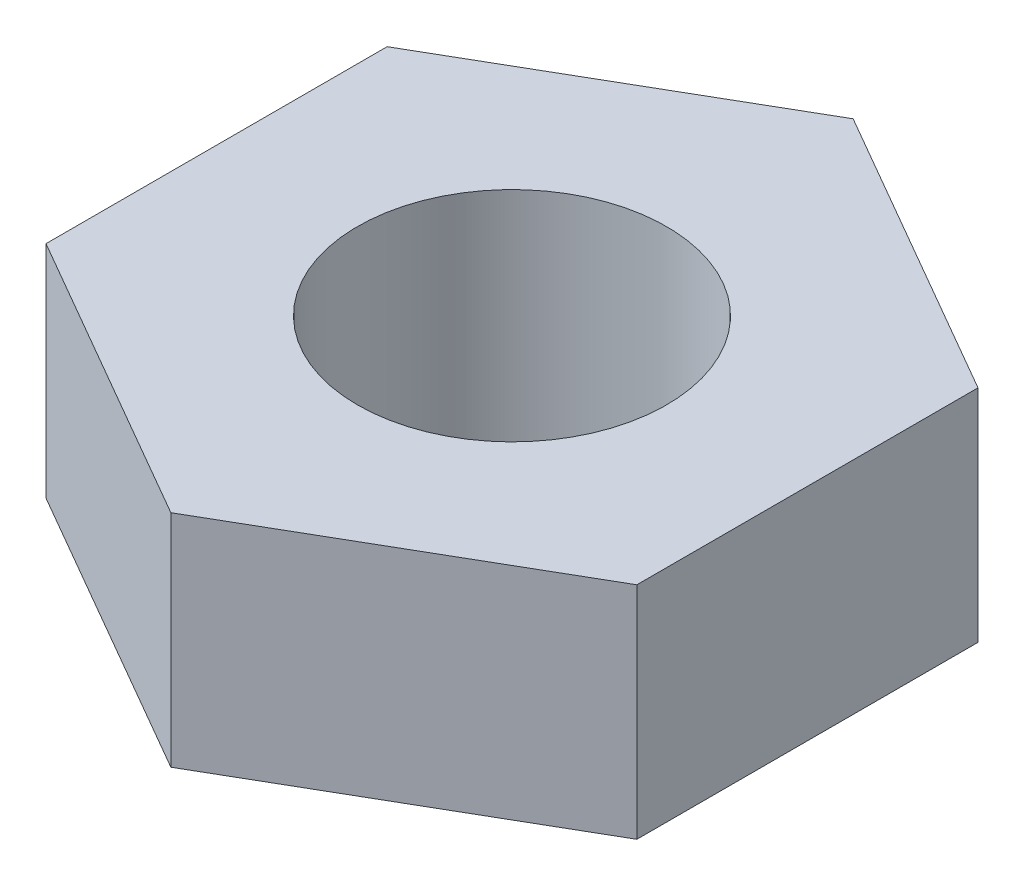
ISO-10303-21;
HEADER;
FILE_DESCRIPTION(('STEP AP214'),'2;1');
FILE_NAME('part.step','',(''),(''),'','','');
FILE_SCHEMA(('AUTOMOTIVE_DESIGN { 1 0 10303 214 1 1 1 1 }'));
ENDSEC;
DATA;
#1=APPLICATION_CONTEXT('core data for automotive mechanical design processes');
#2=APPLICATION_PROTOCOL_DEFINITION('international standard','automotive_design',2000,#1);
#3=PRODUCT_CONTEXT('',#1,'mechanical');
#4=PRODUCT('Part','Part','',(#3));
#5=PRODUCT_RELATED_PRODUCT_CATEGORY('part','',(#4));
#6=PRODUCT_DEFINITION_FORMATION('','',#4);
#7=PRODUCT_DEFINITION_CONTEXT('part definition',#1,'design');
#8=PRODUCT_DEFINITION('design','',#6,#7);
#9=PRODUCT_DEFINITION_SHAPE('','',#8);
#10=(LENGTH_UNIT() NAMED_UNIT(*) SI_UNIT(.MILLI.,.METRE.));
#11=(NAMED_UNIT(*) PLANE_ANGLE_UNIT() SI_UNIT($,.RADIAN.));
#12=(NAMED_UNIT(*) SI_UNIT($,.STERADIAN.) SOLID_ANGLE_UNIT());
#13=UNCERTAINTY_MEASURE_WITH_UNIT(LENGTH_MEASURE(1.E-05),#10,'distance_accuracy_value','');
#14=(GEOMETRIC_REPRESENTATION_CONTEXT(3) GLOBAL_UNCERTAINTY_ASSIGNED_CONTEXT((#13)) GLOBAL_UNIT_ASSIGNED_CONTEXT((#10,
#11,#12)) REPRESENTATION_CONTEXT('',''));
#15=CARTESIAN_POINT('',(0.,0.,0.));
#16=DIRECTION('',(0.,0.,1.));
#17=DIRECTION('',(1.,0.,0.));
#18=AXIS2_PLACEMENT_3D('',#15,#16,#17);
#19=CARTESIAN_POINT('',(0.,4.85,0.));
#20=DIRECTION('',(0.,1.,0.));
#21=DIRECTION('',(0.,0.,1.));
#22=AXIS2_PLACEMENT_3D('',#19,#20,#21);
#23=PLANE('',#22);
#24=DIRECTION('',(0.866025403784439,0.,0.5));
#25=VECTOR('',#24,1.);
#26=CARTESIAN_POINT('',(-6.50000000000001,4.85,3.75277674973259));
#27=LINE('',#26,#25);
#28=CARTESIAN_POINT('',(-6.50000000000001,4.85,3.75277674973259));
#29=VERTEX_POINT('',#28);
#30=CARTESIAN_POINT('',(0.,4.85,7.50555349946516));
#31=VERTEX_POINT('',#30);
#32=EDGE_CURVE('E132',#29,#31,#27,.T.);
#33=ORIENTED_EDGE('',*,*,#32,.T.);
#34=DIRECTION('',(0.866025403784439,0.,-0.5));
#35=VECTOR('',#34,1.);
#36=CARTESIAN_POINT('',(0.,4.85,7.50555349946516));
#37=LINE('',#36,#35);
#38=CARTESIAN_POINT('',(6.49999999999998,4.85,3.75277674973259));
#39=VERTEX_POINT('',#38);
#40=EDGE_CURVE('E90',#31,#39,#37,.T.);
#41=ORIENTED_EDGE('',*,*,#40,.T.);
#42=DIRECTION('',(0.,0.,-1.));
#43=VECTOR('',#42,1.);
#44=CARTESIAN_POINT('',(6.49999999999998,4.85,3.75277674973259));
#45=LINE('',#44,#43);
#46=CARTESIAN_POINT('',(6.49999999999998,4.85,-3.75277674973256));
#47=VERTEX_POINT('',#46);
#48=EDGE_CURVE('E103',#39,#47,#45,.T.);
#49=ORIENTED_EDGE('',*,*,#48,.T.);
#50=DIRECTION('',(-0.866025403784439,0.,-0.5));
#51=VECTOR('',#50,1.);
#52=CARTESIAN_POINT('',(6.49999999999998,4.85,-3.75277674973256));
#53=LINE('',#52,#51);
#54=CARTESIAN_POINT('',(0.,4.85,-7.50555349946512));
#55=VERTEX_POINT('',#54);
#56=EDGE_CURVE('E97',#47,#55,#53,.T.);
#57=ORIENTED_EDGE('',*,*,#56,.T.);
#58=DIRECTION('',(-0.866025403784438,0.,0.5));
#59=VECTOR('',#58,1.);
#60=CARTESIAN_POINT('',(0.,4.85,-7.50555349946512));
#61=LINE('',#60,#59);
#62=CARTESIAN_POINT('',(-6.50000000000001,4.85,-3.75277674973254));
#63=VERTEX_POINT('',#62);
#64=EDGE_CURVE('E101',#55,#63,#61,.T.);
#65=ORIENTED_EDGE('',*,*,#64,.T.);
#66=DIRECTION('',(0.,0.,1.));
#67=VECTOR('',#66,1.);
#68=CARTESIAN_POINT('',(-6.50000000000001,4.85,-3.75277674973254));
#69=LINE('',#68,#67);
#70=EDGE_CURVE('E53',#63,#29,#69,.T.);
#71=ORIENTED_EDGE('',*,*,#70,.T.);
#72=EDGE_LOOP('',(#33,#41,#49,#57,#65,#71));
#73=FACE_BOUND('',#72,.T.);
#74=CARTESIAN_POINT('',(0.,4.85,0.));
#75=DIRECTION('',(0.,1.,0.));
#76=DIRECTION('',(0.,0.,1.));
#77=AXIS2_PLACEMENT_3D('',#74,#75,#76);
#78=CIRCLE('',#77,3.4);
#79=CARTESIAN_POINT('',(0.,4.85,3.4));
#80=VERTEX_POINT('',#79);
#81=EDGE_CURVE('E125',#80,#80,#78,.T.);
#82=ORIENTED_EDGE('',*,*,#81,.F.);
#83=EDGE_LOOP('',(#82));
#84=FACE_BOUND('',#83,.T.);
#85=ADVANCED_FACE('F36',(#73,#84),#23,.T.);
#86=CARTESIAN_POINT('',(0.,0.,0.));
#87=DIRECTION('',(0.,1.,0.));
#88=DIRECTION('',(0.,0.,1.));
#89=AXIS2_PLACEMENT_3D('',#86,#87,#88);
#90=PLANE('',#89);
#91=DIRECTION('',(0.866025403784439,0.,0.5));
#92=VECTOR('',#91,1.);
#93=CARTESIAN_POINT('',(-6.50000000000001,0.,3.75277674973259));
#94=LINE('',#93,#92);
#95=CARTESIAN_POINT('',(-6.50000000000001,0.,3.75277674973259));
#96=VERTEX_POINT('',#95);
#97=CARTESIAN_POINT('',(0.,0.,7.50555349946516));
#98=VERTEX_POINT('',#97);
#99=EDGE_CURVE('E121',#96,#98,#94,.T.);
#100=ORIENTED_EDGE('',*,*,#99,.F.);
#101=DIRECTION('',(0.,0.,1.));
#102=VECTOR('',#101,1.);
#103=CARTESIAN_POINT('',(-6.50000000000001,0.,-3.75277674973254));
#104=LINE('',#103,#102);
#105=CARTESIAN_POINT('',(-6.50000000000001,0.,-3.75277674973254));
#106=VERTEX_POINT('',#105);
#107=EDGE_CURVE('E82',#106,#96,#104,.T.);
#108=ORIENTED_EDGE('',*,*,#107,.F.);
#109=DIRECTION('',(-0.866025403784438,0.,0.5));
#110=VECTOR('',#109,1.);
#111=CARTESIAN_POINT('',(0.,0.,-7.50555349946512));
#112=LINE('',#111,#110);
#113=CARTESIAN_POINT('',(0.,0.,-7.50555349946512));
#114=VERTEX_POINT('',#113);
#115=EDGE_CURVE('E76',#114,#106,#112,.T.);
#116=ORIENTED_EDGE('',*,*,#115,.F.);
#117=DIRECTION('',(-0.866025403784439,0.,-0.5));
#118=VECTOR('',#117,1.);
#119=CARTESIAN_POINT('',(6.49999999999998,0.,-3.75277674973256));
#120=LINE('',#119,#118);
#121=CARTESIAN_POINT('',(6.49999999999998,0.,-3.75277674973256));
#122=VERTEX_POINT('',#121);
#123=EDGE_CURVE('E111',#122,#114,#120,.T.);
#124=ORIENTED_EDGE('',*,*,#123,.F.);
#125=DIRECTION('',(0.,0.,-1.));
#126=VECTOR('',#125,1.);
#127=CARTESIAN_POINT('',(6.49999999999998,0.,3.75277674973259));
#128=LINE('',#127,#126);
#129=CARTESIAN_POINT('',(6.49999999999998,0.,3.75277674973259));
#130=VERTEX_POINT('',#129);
#131=EDGE_CURVE('E127',#130,#122,#128,.T.);
#132=ORIENTED_EDGE('',*,*,#131,.F.);
#133=DIRECTION('',(0.866025403784439,0.,-0.5));
#134=VECTOR('',#133,1.);
#135=CARTESIAN_POINT('',(0.,0.,7.50555349946516));
#136=LINE('',#135,#134);
#137=EDGE_CURVE('E124',#98,#130,#136,.T.);
#138=ORIENTED_EDGE('',*,*,#137,.F.);
#139=EDGE_LOOP('',(#100,#108,#116,#124,#132,#138));
#140=FACE_BOUND('',#139,.T.);
#141=CARTESIAN_POINT('',(0.,0.,0.));
#142=DIRECTION('',(0.,1.,0.));
#143=DIRECTION('',(0.,0.,1.));
#144=AXIS2_PLACEMENT_3D('',#141,#142,#143);
#145=CIRCLE('',#144,3.4);
#146=CARTESIAN_POINT('',(0.,0.,3.4));
#147=VERTEX_POINT('',#146);
#148=EDGE_CURVE('E225',#147,#147,#145,.T.);
#149=ORIENTED_EDGE('',*,*,#148,.T.);
#150=EDGE_LOOP('',(#149));
#151=FACE_BOUND('',#150,.T.);
#152=ADVANCED_FACE('F141',(#140,#151),#90,.F.);
#153=CARTESIAN_POINT('',(-6.50000000000001,4.85,3.75277674973259));
#154=DIRECTION('',(0.5,0.,-0.866025403784439));
#155=DIRECTION('',(-0.866025403784439,0.,-0.5));
#156=AXIS2_PLACEMENT_3D('',#153,#154,#155);
#157=PLANE('',#156);
#158=ORIENTED_EDGE('',*,*,#99,.T.);
#159=DIRECTION('',(0.,-1.,0.));
#160=VECTOR('',#159,1.);
#161=CARTESIAN_POINT('',(0.,4.85,7.50555349946516));
#162=LINE('',#161,#160);
#163=EDGE_CURVE('E11',#31,#98,#162,.T.);
#164=ORIENTED_EDGE('',*,*,#163,.F.);
#165=ORIENTED_EDGE('',*,*,#32,.F.);
#166=DIRECTION('',(0.,-1.,0.));
#167=VECTOR('',#166,1.);
#168=CARTESIAN_POINT('',(-6.50000000000001,4.85,3.75277674973259));
#169=LINE('',#168,#167);
#170=EDGE_CURVE('E117',#29,#96,#169,.T.);
#171=ORIENTED_EDGE('',*,*,#170,.T.);
#172=EDGE_LOOP('',(#158,#164,#165,#171));
#173=FACE_BOUND('',#172,.T.);
#174=ADVANCED_FACE('F38',(#173),#157,.F.);
#175=CARTESIAN_POINT('',(0.,4.85,7.50555349946516));
#176=DIRECTION('',(-0.5,0.,-0.866025403784438));
#177=DIRECTION('',(-0.866025403784438,0.,0.5));
#178=AXIS2_PLACEMENT_3D('',#175,#176,#177);
#179=PLANE('',#178);
#180=ORIENTED_EDGE('',*,*,#137,.T.);
#181=DIRECTION('',(0.,-1.,0.));
#182=VECTOR('',#181,1.);
#183=CARTESIAN_POINT('',(6.49999999999998,4.85,3.75277674973259));
#184=LINE('',#183,#182);
#185=EDGE_CURVE('E45',#39,#130,#184,.T.);
#186=ORIENTED_EDGE('',*,*,#185,.F.);
#187=ORIENTED_EDGE('',*,*,#40,.F.);
#188=ORIENTED_EDGE('',*,*,#163,.T.);
#189=EDGE_LOOP('',(#180,#186,#187,#188));
#190=FACE_BOUND('',#189,.T.);
#191=ADVANCED_FACE('F166',(#190),#179,.F.);
#192=CARTESIAN_POINT('',(6.49999999999998,4.85,3.75277674973259));
#193=DIRECTION('',(-1.,0.,0.));
#194=DIRECTION('',(0.,0.,1.));
#195=AXIS2_PLACEMENT_3D('',#192,#193,#194);
#196=PLANE('',#195);
#197=ORIENTED_EDGE('',*,*,#131,.T.);
#198=DIRECTION('',(0.,-1.,0.));
#199=VECTOR('',#198,1.);
#200=CARTESIAN_POINT('',(6.49999999999998,4.85,-3.75277674973256));
#201=LINE('',#200,#199);
#202=EDGE_CURVE('E112',#47,#122,#201,.T.);
#203=ORIENTED_EDGE('',*,*,#202,.F.);
#204=ORIENTED_EDGE('',*,*,#48,.F.);
#205=ORIENTED_EDGE('',*,*,#185,.T.);
#206=EDGE_LOOP('',(#197,#203,#204,#205));
#207=FACE_BOUND('',#206,.T.);
#208=ADVANCED_FACE('F138',(#207),#196,.F.);
#209=CARTESIAN_POINT('',(6.49999999999998,4.85,-3.75277674973256));
#210=DIRECTION('',(-0.5,0.,0.866025403784439));
#211=DIRECTION('',(0.866025403784439,0.,0.5));
#212=AXIS2_PLACEMENT_3D('',#209,#210,#211);
#213=PLANE('',#212);
#214=ORIENTED_EDGE('',*,*,#123,.T.);
#215=DIRECTION('',(0.,-1.,0.));
#216=VECTOR('',#215,1.);
#217=CARTESIAN_POINT('',(0.,4.85,-7.50555349946512));
#218=LINE('',#217,#216);
#219=EDGE_CURVE('E108',#55,#114,#218,.T.);
#220=ORIENTED_EDGE('',*,*,#219,.F.);
#221=ORIENTED_EDGE('',*,*,#56,.F.);
#222=ORIENTED_EDGE('',*,*,#202,.T.);
#223=EDGE_LOOP('',(#214,#220,#221,#222));
#224=FACE_BOUND('',#223,.T.);
#225=ADVANCED_FACE('F109',(#224),#213,.F.);
#226=CARTESIAN_POINT('',(0.,4.85,-7.50555349946512));
#227=DIRECTION('',(0.5,0.,0.866025403784438));
#228=DIRECTION('',(0.866025403784438,0.,-0.5));
#229=AXIS2_PLACEMENT_3D('',#226,#227,#228);
#230=PLANE('',#229);
#231=ORIENTED_EDGE('',*,*,#115,.T.);
#232=DIRECTION('',(0.,-1.,0.));
#233=VECTOR('',#232,1.);
#234=CARTESIAN_POINT('',(-6.50000000000001,4.85,-3.75277674973254));
#235=LINE('',#234,#233);
#236=EDGE_CURVE('E113',#63,#106,#235,.T.);
#237=ORIENTED_EDGE('',*,*,#236,.F.);
#238=ORIENTED_EDGE('',*,*,#64,.F.);
#239=ORIENTED_EDGE('',*,*,#219,.T.);
#240=EDGE_LOOP('',(#231,#237,#238,#239));
#241=FACE_BOUND('',#240,.T.);
#242=ADVANCED_FACE('F115',(#241),#230,.F.);
#243=CARTESIAN_POINT('',(-6.50000000000001,4.85,-3.75277674973254));
#244=DIRECTION('',(1.,0.,0.));
#245=DIRECTION('',(0.,0.,-1.));
#246=AXIS2_PLACEMENT_3D('',#243,#244,#245);
#247=PLANE('',#246);
#248=ORIENTED_EDGE('',*,*,#107,.T.);
#249=ORIENTED_EDGE('',*,*,#170,.F.);
#250=ORIENTED_EDGE('',*,*,#70,.F.);
#251=ORIENTED_EDGE('',*,*,#236,.T.);
#252=EDGE_LOOP('',(#248,#249,#250,#251));
#253=FACE_BOUND('',#252,.T.);
#254=ADVANCED_FACE('F146',(#253),#247,.F.);
#255=CARTESIAN_POINT('',(0.,4.85,0.));
#256=DIRECTION('',(0.,-1.,0.));
#257=DIRECTION('',(0.,0.,-1.));
#258=AXIS2_PLACEMENT_3D('',#255,#256,#257);
#259=CYLINDRICAL_SURFACE('',#258,3.4);
#260=ORIENTED_EDGE('',*,*,#81,.T.);
#261=EDGE_LOOP('',(#260));
#262=FACE_BOUND('',#261,.T.);
#263=ORIENTED_EDGE('',*,*,#148,.F.);
#264=EDGE_LOOP('',(#263));
#265=FACE_BOUND('',#264,.T.);
#266=ADVANCED_FACE('F148',(#262,#265),#259,.F.);
#267=CLOSED_SHELL('',(#85,#152,#174,#191,#208,#225,#242,#254,#266));
#268=MANIFOLD_SOLID_BREP('B2',#267);
#269=ADVANCED_BREP_SHAPE_REPRESENTATION('',(#18,#268),#14);
#270=SHAPE_DEFINITION_REPRESENTATION(#9,#269);
ENDSEC;
END-ISO-10303-21;
